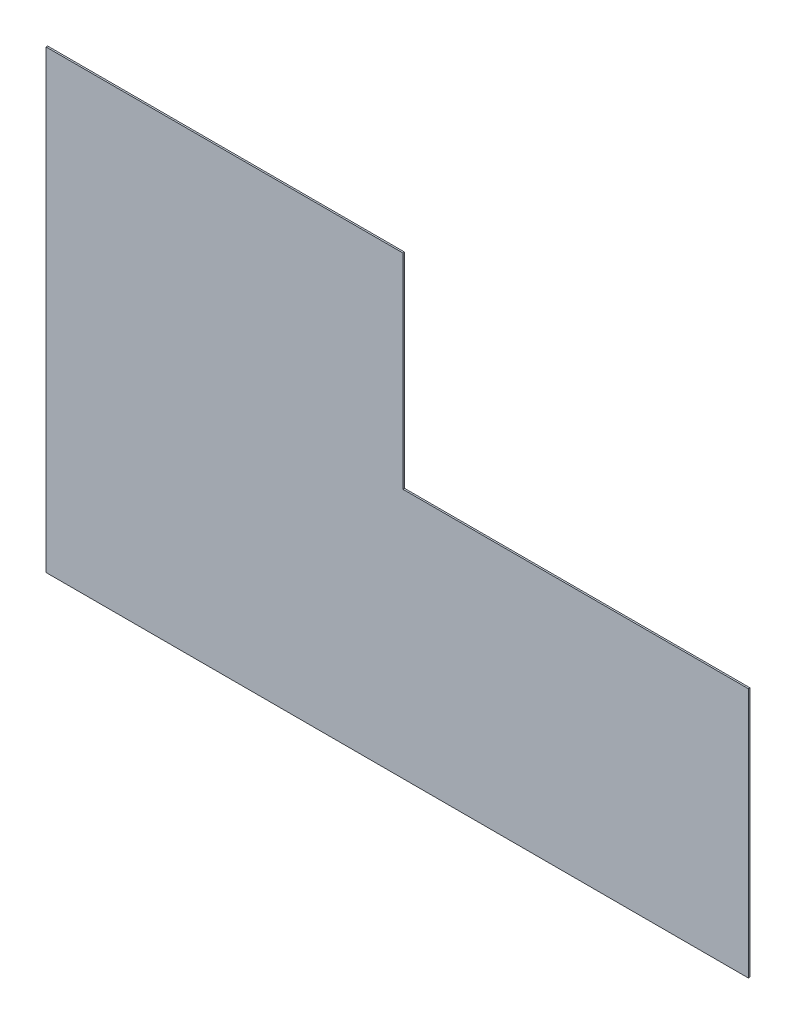
ISO-10303-21;
HEADER;
FILE_DESCRIPTION(('STEP AP214'),'2;1');
FILE_NAME('part.step','',(''),(''),'','','');
FILE_SCHEMA(('AUTOMOTIVE_DESIGN { 1 0 10303 214 1 1 1 1 }'));
ENDSEC;
DATA;
#1=APPLICATION_CONTEXT('core data for automotive mechanical design processes');
#2=APPLICATION_PROTOCOL_DEFINITION('international standard','automotive_design',2000,#1);
#3=PRODUCT_CONTEXT('',#1,'mechanical');
#4=PRODUCT('Part','Part','',(#3));
#5=PRODUCT_RELATED_PRODUCT_CATEGORY('part','',(#4));
#6=PRODUCT_DEFINITION_FORMATION('','',#4);
#7=PRODUCT_DEFINITION_CONTEXT('part definition',#1,'design');
#8=PRODUCT_DEFINITION('design','',#6,#7);
#9=PRODUCT_DEFINITION_SHAPE('','',#8);
#10=(LENGTH_UNIT() NAMED_UNIT(*) SI_UNIT(.MILLI.,.METRE.));
#11=(NAMED_UNIT(*) PLANE_ANGLE_UNIT() SI_UNIT($,.RADIAN.));
#12=(NAMED_UNIT(*) SI_UNIT($,.STERADIAN.) SOLID_ANGLE_UNIT());
#13=UNCERTAINTY_MEASURE_WITH_UNIT(LENGTH_MEASURE(1.E-05),#10,'distance_accuracy_value','');
#14=(GEOMETRIC_REPRESENTATION_CONTEXT(3) GLOBAL_UNCERTAINTY_ASSIGNED_CONTEXT((#13)) GLOBAL_UNIT_ASSIGNED_CONTEXT((#10,
#11,#12)) REPRESENTATION_CONTEXT('',''));
#15=CARTESIAN_POINT('',(0.,0.,0.));
#16=DIRECTION('',(0.,0.,1.));
#17=DIRECTION('',(1.,0.,0.));
#18=AXIS2_PLACEMENT_3D('',#15,#16,#17);
#19=CARTESIAN_POINT('',(0.,0.,1.5875));
#20=DIRECTION('',(-1.,0.,0.));
#21=DIRECTION('',(0.,0.,1.));
#22=AXIS2_PLACEMENT_3D('',#19,#20,#21);
#23=PLANE('',#22);
#24=DIRECTION('',(0.,1.,0.));
#25=VECTOR('',#24,1.);
#26=CARTESIAN_POINT('',(0.,0.,0.));
#27=LINE('',#26,#25);
#28=CARTESIAN_POINT('',(0.,0.,0.));
#29=VERTEX_POINT('',#28);
#30=CARTESIAN_POINT('',(0.,244.6657,0.));
#31=VERTEX_POINT('',#30);
#32=EDGE_CURVE('E117',#29,#31,#27,.T.);
#33=ORIENTED_EDGE('',*,*,#32,.T.);
#34=DIRECTION('',(0.,0.,-1.));
#35=VECTOR('',#34,1.);
#36=CARTESIAN_POINT('',(0.,244.6657,1.5875));
#37=LINE('',#36,#35);
#38=CARTESIAN_POINT('',(0.,244.6657,1.5875));
#39=VERTEX_POINT('',#38);
#40=EDGE_CURVE('E11',#39,#31,#37,.T.);
#41=ORIENTED_EDGE('',*,*,#40,.F.);
#42=DIRECTION('',(0.,1.,0.));
#43=VECTOR('',#42,1.);
#44=CARTESIAN_POINT('',(0.,0.,1.5875));
#45=LINE('',#44,#43);
#46=CARTESIAN_POINT('',(0.,0.,1.5875));
#47=VERTEX_POINT('',#46);
#48=EDGE_CURVE('E127',#47,#39,#45,.T.);
#49=ORIENTED_EDGE('',*,*,#48,.F.);
#50=DIRECTION('',(0.,0.,-1.));
#51=VECTOR('',#50,1.);
#52=CARTESIAN_POINT('',(0.,0.,1.5875));
#53=LINE('',#52,#51);
#54=EDGE_CURVE('E113',#47,#29,#53,.T.);
#55=ORIENTED_EDGE('',*,*,#54,.T.);
#56=EDGE_LOOP('',(#33,#41,#49,#55));
#57=FACE_BOUND('',#56,.T.);
#58=ADVANCED_FACE('F33',(#57),#23,.F.);
#59=CARTESIAN_POINT('',(0.,244.6657,1.5875));
#60=DIRECTION('',(0.,-1.,0.));
#61=DIRECTION('',(0.,0.,-1.));
#62=AXIS2_PLACEMENT_3D('',#59,#60,#61);
#63=PLANE('',#62);
#64=DIRECTION('',(-1.,0.,0.));
#65=VECTOR('',#64,1.);
#66=CARTESIAN_POINT('',(0.,244.6657,0.));
#67=LINE('',#66,#65);
#68=CARTESIAN_POINT('',(-337.206993923197,244.6657,0.));
#69=VERTEX_POINT('',#68);
#70=EDGE_CURVE('E120',#31,#69,#67,.T.);
#71=ORIENTED_EDGE('',*,*,#70,.T.);
#72=DIRECTION('',(0.,0.,-1.));
#73=VECTOR('',#72,1.);
#74=CARTESIAN_POINT('',(-337.206993923197,244.6657,1.5875));
#75=LINE('',#74,#73);
#76=CARTESIAN_POINT('',(-337.206993923197,244.6657,1.5875));
#77=VERTEX_POINT('',#76);
#78=EDGE_CURVE('E41',#77,#69,#75,.T.);
#79=ORIENTED_EDGE('',*,*,#78,.F.);
#80=DIRECTION('',(-1.,0.,0.));
#81=VECTOR('',#80,1.);
#82=CARTESIAN_POINT('',(0.,244.6657,1.5875));
#83=LINE('',#82,#81);
#84=EDGE_CURVE('E86',#39,#77,#83,.T.);
#85=ORIENTED_EDGE('',*,*,#84,.F.);
#86=ORIENTED_EDGE('',*,*,#40,.T.);
#87=EDGE_LOOP('',(#71,#79,#85,#86));
#88=FACE_BOUND('',#87,.T.);
#89=ADVANCED_FACE('F151',(#88),#63,.F.);
#90=CARTESIAN_POINT('',(-337.206993923197,244.6657,1.5875));
#91=DIRECTION('',(-1.,0.,0.));
#92=DIRECTION('',(0.,0.,1.));
#93=AXIS2_PLACEMENT_3D('',#90,#91,#92);
#94=PLANE('',#93);
#95=DIRECTION('',(0.,1.,0.));
#96=VECTOR('',#95,1.);
#97=CARTESIAN_POINT('',(-337.206993923197,244.6657,0.));
#98=LINE('',#97,#96);
#99=CARTESIAN_POINT('',(-337.206993923197,444.5,0.));
#100=VERTEX_POINT('',#99);
#101=EDGE_CURVE('E122',#69,#100,#98,.T.);
#102=ORIENTED_EDGE('',*,*,#101,.T.);
#103=DIRECTION('',(0.,0.,-1.));
#104=VECTOR('',#103,1.);
#105=CARTESIAN_POINT('',(-337.206993923197,444.5,1.5875));
#106=LINE('',#105,#104);
#107=CARTESIAN_POINT('',(-337.206993923197,444.5,1.5875));
#108=VERTEX_POINT('',#107);
#109=EDGE_CURVE('E108',#108,#100,#106,.T.);
#110=ORIENTED_EDGE('',*,*,#109,.F.);
#111=DIRECTION('',(0.,1.,0.));
#112=VECTOR('',#111,1.);
#113=CARTESIAN_POINT('',(-337.206993923197,244.6657,1.5875));
#114=LINE('',#113,#112);
#115=EDGE_CURVE('E99',#77,#108,#114,.T.);
#116=ORIENTED_EDGE('',*,*,#115,.F.);
#117=ORIENTED_EDGE('',*,*,#78,.T.);
#118=EDGE_LOOP('',(#102,#110,#116,#117));
#119=FACE_BOUND('',#118,.T.);
#120=ADVANCED_FACE('F133',(#119),#94,.F.);
#121=CARTESIAN_POINT('',(-337.206993923197,444.5,1.5875));
#122=DIRECTION('',(0.,-1.,0.));
#123=DIRECTION('',(1.,0.,0.));
#124=AXIS2_PLACEMENT_3D('',#121,#122,#123);
#125=PLANE('',#124);
#126=DIRECTION('',(-1.,0.,0.));
#127=VECTOR('',#126,1.);
#128=CARTESIAN_POINT('',(-337.206993923197,444.5,0.));
#129=LINE('',#128,#127);
#130=CARTESIAN_POINT('',(-685.8,444.5,0.));
#131=VERTEX_POINT('',#130);
#132=EDGE_CURVE('E107',#100,#131,#129,.T.);
#133=ORIENTED_EDGE('',*,*,#132,.T.);
#134=DIRECTION('',(0.,0.,-1.));
#135=VECTOR('',#134,1.);
#136=CARTESIAN_POINT('',(-685.8,444.5,1.5875));
#137=LINE('',#136,#135);
#138=CARTESIAN_POINT('',(-685.8,444.5,1.5875));
#139=VERTEX_POINT('',#138);
#140=EDGE_CURVE('E104',#139,#131,#137,.T.);
#141=ORIENTED_EDGE('',*,*,#140,.F.);
#142=DIRECTION('',(-1.,0.,0.));
#143=VECTOR('',#142,1.);
#144=CARTESIAN_POINT('',(-337.206993923197,444.5,1.5875));
#145=LINE('',#144,#143);
#146=EDGE_CURVE('E93',#108,#139,#145,.T.);
#147=ORIENTED_EDGE('',*,*,#146,.F.);
#148=ORIENTED_EDGE('',*,*,#109,.T.);
#149=EDGE_LOOP('',(#133,#141,#147,#148));
#150=FACE_BOUND('',#149,.T.);
#151=ADVANCED_FACE('F105',(#150),#125,.F.);
#152=CARTESIAN_POINT('',(-685.8,0.,1.5875));
#153=DIRECTION('',(1.,0.,0.));
#154=DIRECTION('',(0.,0.,-1.));
#155=AXIS2_PLACEMENT_3D('',#152,#153,#154);
#156=PLANE('',#155);
#157=DIRECTION('',(0.,-1.,0.));
#158=VECTOR('',#157,1.);
#159=CARTESIAN_POINT('',(-685.8,0.,0.));
#160=LINE('',#159,#158);
#161=CARTESIAN_POINT('',(-685.8,0.,0.));
#162=VERTEX_POINT('',#161);
#163=EDGE_CURVE('E72',#131,#162,#160,.T.);
#164=ORIENTED_EDGE('',*,*,#163,.T.);
#165=DIRECTION('',(0.,0.,-1.));
#166=VECTOR('',#165,1.);
#167=CARTESIAN_POINT('',(-685.8,0.,1.5875));
#168=LINE('',#167,#166);
#169=CARTESIAN_POINT('',(-685.8,0.,1.5875));
#170=VERTEX_POINT('',#169);
#171=EDGE_CURVE('E109',#170,#162,#168,.T.);
#172=ORIENTED_EDGE('',*,*,#171,.F.);
#173=DIRECTION('',(0.,-1.,0.));
#174=VECTOR('',#173,1.);
#175=CARTESIAN_POINT('',(-685.8,0.,1.5875));
#176=LINE('',#175,#174);
#177=EDGE_CURVE('E97',#139,#170,#176,.T.);
#178=ORIENTED_EDGE('',*,*,#177,.F.);
#179=ORIENTED_EDGE('',*,*,#140,.T.);
#180=EDGE_LOOP('',(#164,#172,#178,#179));
#181=FACE_BOUND('',#180,.T.);
#182=ADVANCED_FACE('F111',(#181),#156,.F.);
#183=CARTESIAN_POINT('',(0.,0.,1.5875));
#184=DIRECTION('',(0.,1.,0.));
#185=DIRECTION('',(-1.,0.,0.));
#186=AXIS2_PLACEMENT_3D('',#183,#184,#185);
#187=PLANE('',#186);
#188=DIRECTION('',(1.,0.,0.));
#189=VECTOR('',#188,1.);
#190=CARTESIAN_POINT('',(0.,0.,0.));
#191=LINE('',#190,#189);
#192=EDGE_CURVE('E78',#162,#29,#191,.T.);
#193=ORIENTED_EDGE('',*,*,#192,.T.);
#194=ORIENTED_EDGE('',*,*,#54,.F.);
#195=DIRECTION('',(1.,0.,0.));
#196=VECTOR('',#195,1.);
#197=CARTESIAN_POINT('',(0.,0.,1.5875));
#198=LINE('',#197,#196);
#199=EDGE_CURVE('E49',#170,#47,#198,.T.);
#200=ORIENTED_EDGE('',*,*,#199,.F.);
#201=ORIENTED_EDGE('',*,*,#171,.T.);
#202=EDGE_LOOP('',(#193,#194,#200,#201));
#203=FACE_BOUND('',#202,.T.);
#204=ADVANCED_FACE('F140',(#203),#187,.F.);
#205=CARTESIAN_POINT('',(0.,0.,1.5875));
#206=DIRECTION('',(0.,0.,1.));
#207=DIRECTION('',(1.,0.,0.));
#208=AXIS2_PLACEMENT_3D('',#205,#206,#207);
#209=PLANE('',#208);
#210=ORIENTED_EDGE('',*,*,#48,.T.);
#211=ORIENTED_EDGE('',*,*,#84,.T.);
#212=ORIENTED_EDGE('',*,*,#115,.T.);
#213=ORIENTED_EDGE('',*,*,#146,.T.);
#214=ORIENTED_EDGE('',*,*,#177,.T.);
#215=ORIENTED_EDGE('',*,*,#199,.T.);
#216=EDGE_LOOP('',(#210,#211,#212,#213,#214,#215));
#217=FACE_BOUND('',#216,.T.);
#218=ADVANCED_FACE('F95',(#217),#209,.T.);
#219=CARTESIAN_POINT('',(0.,0.,0.));
#220=DIRECTION('',(0.,0.,1.));
#221=DIRECTION('',(1.,0.,0.));
#222=AXIS2_PLACEMENT_3D('',#219,#220,#221);
#223=PLANE('',#222);
#224=ORIENTED_EDGE('',*,*,#32,.F.);
#225=ORIENTED_EDGE('',*,*,#192,.F.);
#226=ORIENTED_EDGE('',*,*,#163,.F.);
#227=ORIENTED_EDGE('',*,*,#132,.F.);
#228=ORIENTED_EDGE('',*,*,#101,.F.);
#229=ORIENTED_EDGE('',*,*,#70,.F.);
#230=EDGE_LOOP('',(#224,#225,#226,#227,#228,#229));
#231=FACE_BOUND('',#230,.T.);
#232=ADVANCED_FACE('F136',(#231),#223,.F.);
#233=CLOSED_SHELL('',(#58,#89,#120,#151,#182,#204,#218,#232));
#234=MANIFOLD_SOLID_BREP('B2',#233);
#235=ADVANCED_BREP_SHAPE_REPRESENTATION('',(#18,#234),#14);
#236=SHAPE_DEFINITION_REPRESENTATION(#9,#235);
ENDSEC;
END-ISO-10303-21;
